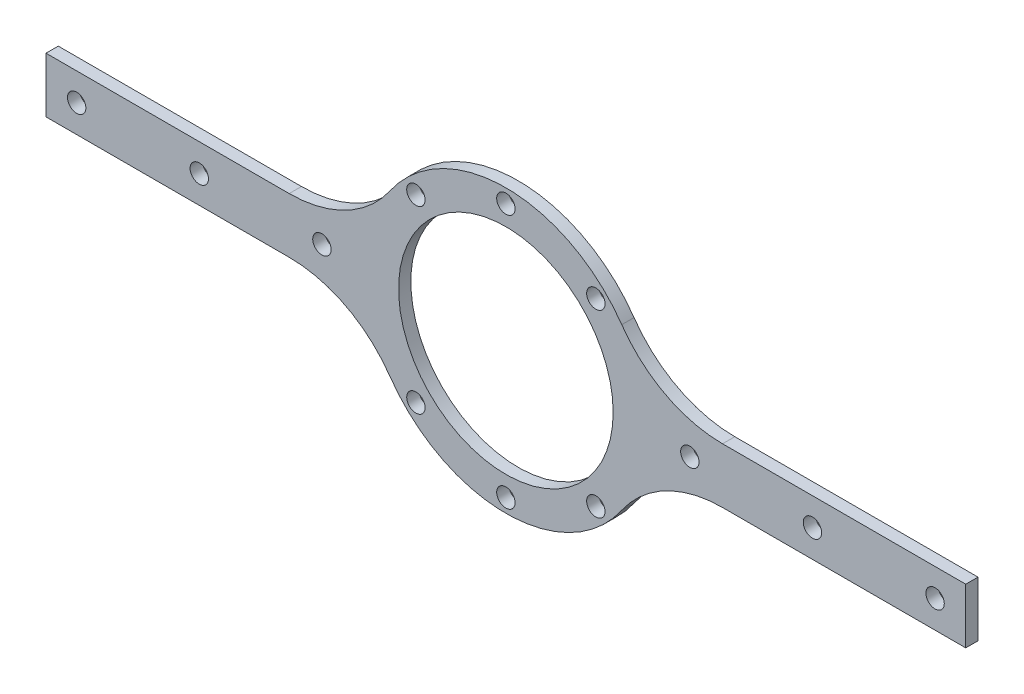
ISO-10303-21;
HEADER;
FILE_DESCRIPTION(('STEP AP214'),'2;1');
FILE_NAME('part.step','',(''),(''),'','','');
FILE_SCHEMA(('AUTOMOTIVE_DESIGN { 1 0 10303 214 1 1 1 1 }'));
ENDSEC;
DATA;
#1=APPLICATION_CONTEXT('core data for automotive mechanical design processes');
#2=APPLICATION_PROTOCOL_DEFINITION('international standard','automotive_design',2000,#1);
#3=PRODUCT_CONTEXT('',#1,'mechanical');
#4=PRODUCT('Part','Part','',(#3));
#5=PRODUCT_RELATED_PRODUCT_CATEGORY('part','',(#4));
#6=PRODUCT_DEFINITION_FORMATION('','',#4);
#7=PRODUCT_DEFINITION_CONTEXT('part definition',#1,'design');
#8=PRODUCT_DEFINITION('design','',#6,#7);
#9=PRODUCT_DEFINITION_SHAPE('','',#8);
#10=(LENGTH_UNIT() NAMED_UNIT(*) SI_UNIT(.MILLI.,.METRE.));
#11=(NAMED_UNIT(*) PLANE_ANGLE_UNIT() SI_UNIT($,.RADIAN.));
#12=(NAMED_UNIT(*) SI_UNIT($,.STERADIAN.) SOLID_ANGLE_UNIT());
#13=UNCERTAINTY_MEASURE_WITH_UNIT(LENGTH_MEASURE(1.E-05),#10,'distance_accuracy_value','');
#14=(GEOMETRIC_REPRESENTATION_CONTEXT(3) GLOBAL_UNCERTAINTY_ASSIGNED_CONTEXT((#13)) GLOBAL_UNIT_ASSIGNED_CONTEXT((#10,
#11,#12)) REPRESENTATION_CONTEXT('',''));
#15=CARTESIAN_POINT('',(0.,0.,0.));
#16=DIRECTION('',(0.,0.,1.));
#17=DIRECTION('',(1.,0.,0.));
#18=AXIS2_PLACEMENT_3D('',#15,#16,#17);
#19=CARTESIAN_POINT('',(75.,-4.5,-2.));
#20=DIRECTION('',(1.,0.,0.));
#21=DIRECTION('',(0.,0.,-1.));
#22=AXIS2_PLACEMENT_3D('',#19,#20,#21);
#23=PLANE('',#22);
#24=DIRECTION('',(0.,1.,0.));
#25=VECTOR('',#24,1.);
#26=CARTESIAN_POINT('',(75.,-4.5,0.));
#27=LINE('',#26,#25);
#28=CARTESIAN_POINT('',(75.,-4.5,0.));
#29=VERTEX_POINT('',#28);
#30=CARTESIAN_POINT('',(75.,4.5,0.));
#31=VERTEX_POINT('',#30);
#32=EDGE_CURVE('E193',#29,#31,#27,.T.);
#33=ORIENTED_EDGE('',*,*,#32,.F.);
#34=DIRECTION('',(0.,0.,1.));
#35=VECTOR('',#34,1.);
#36=CARTESIAN_POINT('',(75.,-4.5,-2.));
#37=LINE('',#36,#35);
#38=CARTESIAN_POINT('',(75.,-4.5,-2.));
#39=VERTEX_POINT('',#38);
#40=EDGE_CURVE('E162',#39,#29,#37,.T.);
#41=ORIENTED_EDGE('',*,*,#40,.F.);
#42=DIRECTION('',(0.,1.,0.));
#43=VECTOR('',#42,1.);
#44=CARTESIAN_POINT('',(75.,-4.5,-2.));
#45=LINE('',#44,#43);
#46=CARTESIAN_POINT('',(75.,4.5,-2.));
#47=VERTEX_POINT('',#46);
#48=EDGE_CURVE('E153',#39,#47,#45,.T.);
#49=ORIENTED_EDGE('',*,*,#48,.T.);
#50=DIRECTION('',(0.,0.,1.));
#51=VECTOR('',#50,1.);
#52=CARTESIAN_POINT('',(75.,4.5,-2.));
#53=LINE('',#52,#51);
#54=EDGE_CURVE('E133',#47,#31,#53,.T.);
#55=ORIENTED_EDGE('',*,*,#54,.T.);
#56=EDGE_LOOP('',(#33,#41,#49,#55));
#57=FACE_BOUND('',#56,.T.);
#58=ADVANCED_FACE('F45',(#57),#23,.T.);
#59=CARTESIAN_POINT('',(22.5554871372799,-4.5,-2.));
#60=DIRECTION('',(0.,-1.,0.));
#61=DIRECTION('',(1.,0.,0.));
#62=AXIS2_PLACEMENT_3D('',#59,#60,#61);
#63=PLANE('',#62);
#64=DIRECTION('',(1.,0.,0.));
#65=VECTOR('',#64,1.);
#66=CARTESIAN_POINT('',(22.5554871372799,-4.5,0.));
#67=LINE('',#66,#65);
#68=CARTESIAN_POINT('',(35.3376569681692,-4.5,0.));
#69=VERTEX_POINT('',#68);
#70=EDGE_CURVE('E164',#69,#29,#67,.T.);
#71=ORIENTED_EDGE('',*,*,#70,.F.);
#72=DIRECTION('',(0.,0.,-1.));
#73=VECTOR('',#72,1.);
#74=CARTESIAN_POINT('',(35.3376569681692,-4.5,-2.));
#75=LINE('',#74,#73);
#76=CARTESIAN_POINT('',(35.3376569681692,-4.5,-2.));
#77=VERTEX_POINT('',#76);
#78=EDGE_CURVE('E231',#69,#77,#75,.T.);
#79=ORIENTED_EDGE('',*,*,#78,.T.);
#80=DIRECTION('',(1.,0.,0.));
#81=VECTOR('',#80,1.);
#82=CARTESIAN_POINT('',(22.5554871372799,-4.5,-2.));
#83=LINE('',#82,#81);
#84=EDGE_CURVE('E147',#77,#39,#83,.T.);
#85=ORIENTED_EDGE('',*,*,#84,.T.);
#86=ORIENTED_EDGE('',*,*,#40,.T.);
#87=EDGE_LOOP('',(#71,#79,#85,#86));
#88=FACE_BOUND('',#87,.T.);
#89=ADVANCED_FACE('F289',(#88),#63,.T.);
#90=CARTESIAN_POINT('',(0.,0.,-2.));
#91=DIRECTION('',(0.,0.,1.));
#92=DIRECTION('',(1.,0.,0.));
#93=AXIS2_PLACEMENT_3D('',#90,#91,#92);
#94=CYLINDRICAL_SURFACE('',#93,23.);
#95=CARTESIAN_POINT('',(0.,0.,-2.));
#96=DIRECTION('',(0.,0.,1.));
#97=DIRECTION('',(-1.,0.,0.));
#98=AXIS2_PLACEMENT_3D('',#95,#96,#97);
#99=CIRCLE('',#98,23.);
#100=CARTESIAN_POINT('',(-18.9015374480905,-13.1046511627907,-2.));
#101=VERTEX_POINT('',#100);
#102=CARTESIAN_POINT('',(18.9015374480905,-13.1046511627907,-2.));
#103=VERTEX_POINT('',#102);
#104=EDGE_CURVE('E187',#101,#103,#99,.T.);
#105=ORIENTED_EDGE('',*,*,#104,.T.);
#106=DIRECTION('',(0.,0.,1.));
#107=VECTOR('',#106,1.);
#108=CARTESIAN_POINT('',(18.9015374480905,-13.1046511627907,-2.));
#109=LINE('',#108,#107);
#110=CARTESIAN_POINT('',(18.9015374480905,-13.1046511627907,0.));
#111=VERTEX_POINT('',#110);
#112=EDGE_CURVE('E227',#103,#111,#109,.T.);
#113=ORIENTED_EDGE('',*,*,#112,.T.);
#114=CARTESIAN_POINT('',(0.,0.,0.));
#115=DIRECTION('',(0.,0.,1.));
#116=DIRECTION('',(-1.,0.,0.));
#117=AXIS2_PLACEMENT_3D('',#114,#115,#116);
#118=CIRCLE('',#117,23.);
#119=CARTESIAN_POINT('',(-18.9015374480905,-13.1046511627907,0.));
#120=VERTEX_POINT('',#119);
#121=EDGE_CURVE('E167',#120,#111,#118,.T.);
#122=ORIENTED_EDGE('',*,*,#121,.F.);
#123=DIRECTION('',(0.,0.,1.));
#124=VECTOR('',#123,1.);
#125=CARTESIAN_POINT('',(-18.9015374480905,-13.1046511627907,-2.));
#126=LINE('',#125,#124);
#127=EDGE_CURVE('E218',#120,#101,#126,.F.);
#128=ORIENTED_EDGE('',*,*,#127,.T.);
#129=EDGE_LOOP('',(#105,#113,#122,#128));
#130=FACE_BOUND('',#129,.T.);
#131=ADVANCED_FACE('F281',(#130),#94,.T.);
#132=CARTESIAN_POINT('',(-75.,-4.5,-2.));
#133=DIRECTION('',(0.,-1.,0.));
#134=DIRECTION('',(1.,0.,0.));
#135=AXIS2_PLACEMENT_3D('',#132,#133,#134);
#136=PLANE('',#135);
#137=DIRECTION('',(1.,0.,0.));
#138=VECTOR('',#137,1.);
#139=CARTESIAN_POINT('',(-75.,-4.5,-2.));
#140=LINE('',#139,#138);
#141=CARTESIAN_POINT('',(-75.,-4.5,-2.));
#142=VERTEX_POINT('',#141);
#143=CARTESIAN_POINT('',(-35.3376569681692,-4.5,-2.));
#144=VERTEX_POINT('',#143);
#145=EDGE_CURVE('E183',#142,#144,#140,.T.);
#146=ORIENTED_EDGE('',*,*,#145,.T.);
#147=DIRECTION('',(0.,0.,-1.));
#148=VECTOR('',#147,1.);
#149=CARTESIAN_POINT('',(-35.3376569681692,-4.5,0.));
#150=LINE('',#149,#148);
#151=CARTESIAN_POINT('',(-35.3376569681692,-4.5,0.));
#152=VERTEX_POINT('',#151);
#153=EDGE_CURVE('E244',#144,#152,#150,.F.);
#154=ORIENTED_EDGE('',*,*,#153,.T.);
#155=DIRECTION('',(1.,0.,0.));
#156=VECTOR('',#155,1.);
#157=CARTESIAN_POINT('',(-75.,-4.5,0.));
#158=LINE('',#157,#156);
#159=CARTESIAN_POINT('',(-75.,-4.5,0.));
#160=VERTEX_POINT('',#159);
#161=EDGE_CURVE('E209',#160,#152,#158,.T.);
#162=ORIENTED_EDGE('',*,*,#161,.F.);
#163=DIRECTION('',(0.,0.,1.));
#164=VECTOR('',#163,1.);
#165=CARTESIAN_POINT('',(-75.,-4.5,-2.));
#166=LINE('',#165,#164);
#167=EDGE_CURVE('E219',#142,#160,#166,.T.);
#168=ORIENTED_EDGE('',*,*,#167,.F.);
#169=EDGE_LOOP('',(#146,#154,#162,#168));
#170=FACE_BOUND('',#169,.T.);
#171=ADVANCED_FACE('F275',(#170),#136,.T.);
#172=CARTESIAN_POINT('',(-75.,-4.5,-2.));
#173=DIRECTION('',(-1.,0.,0.));
#174=DIRECTION('',(0.,0.,1.));
#175=AXIS2_PLACEMENT_3D('',#172,#173,#174);
#176=PLANE('',#175);
#177=DIRECTION('',(0.,-1.,0.));
#178=VECTOR('',#177,1.);
#179=CARTESIAN_POINT('',(-75.,-4.5,0.));
#180=LINE('',#179,#178);
#181=CARTESIAN_POINT('',(-75.,4.5,0.));
#182=VERTEX_POINT('',#181);
#183=EDGE_CURVE('E205',#182,#160,#180,.T.);
#184=ORIENTED_EDGE('',*,*,#183,.F.);
#185=DIRECTION('',(0.,0.,1.));
#186=VECTOR('',#185,1.);
#187=CARTESIAN_POINT('',(-75.,4.5,-2.));
#188=LINE('',#187,#186);
#189=CARTESIAN_POINT('',(-75.,4.5,-2.));
#190=VERTEX_POINT('',#189);
#191=EDGE_CURVE('E146',#190,#182,#188,.T.);
#192=ORIENTED_EDGE('',*,*,#191,.F.);
#193=DIRECTION('',(0.,-1.,0.));
#194=VECTOR('',#193,1.);
#195=CARTESIAN_POINT('',(-75.,-4.5,-2.));
#196=LINE('',#195,#194);
#197=EDGE_CURVE('E179',#190,#142,#196,.T.);
#198=ORIENTED_EDGE('',*,*,#197,.T.);
#199=ORIENTED_EDGE('',*,*,#167,.T.);
#200=EDGE_LOOP('',(#184,#192,#198,#199));
#201=FACE_BOUND('',#200,.T.);
#202=ADVANCED_FACE('F319',(#201),#176,.T.);
#203=CARTESIAN_POINT('',(-75.,4.5,-2.));
#204=DIRECTION('',(0.,1.,0.));
#205=DIRECTION('',(0.,0.,1.));
#206=AXIS2_PLACEMENT_3D('',#203,#204,#205);
#207=PLANE('',#206);
#208=DIRECTION('',(-1.,0.,0.));
#209=VECTOR('',#208,1.);
#210=CARTESIAN_POINT('',(-75.,4.5,0.));
#211=LINE('',#210,#209);
#212=CARTESIAN_POINT('',(-35.3376569681692,4.5,0.));
#213=VERTEX_POINT('',#212);
#214=EDGE_CURVE('E202',#213,#182,#211,.T.);
#215=ORIENTED_EDGE('',*,*,#214,.F.);
#216=DIRECTION('',(0.,0.,-1.));
#217=VECTOR('',#216,1.);
#218=CARTESIAN_POINT('',(-35.3376569681692,4.5,-2.));
#219=LINE('',#218,#217);
#220=CARTESIAN_POINT('',(-35.3376569681692,4.5,-2.));
#221=VERTEX_POINT('',#220);
#222=EDGE_CURVE('E61',#213,#221,#219,.T.);
#223=ORIENTED_EDGE('',*,*,#222,.T.);
#224=DIRECTION('',(-1.,0.,0.));
#225=VECTOR('',#224,1.);
#226=CARTESIAN_POINT('',(-75.,4.5,-2.));
#227=LINE('',#226,#225);
#228=EDGE_CURVE('E176',#221,#190,#227,.T.);
#229=ORIENTED_EDGE('',*,*,#228,.T.);
#230=ORIENTED_EDGE('',*,*,#191,.T.);
#231=EDGE_LOOP('',(#215,#223,#229,#230));
#232=FACE_BOUND('',#231,.T.);
#233=ADVANCED_FACE('F316',(#232),#207,.T.);
#234=CARTESIAN_POINT('',(0.,0.,-2.));
#235=DIRECTION('',(0.,0.,1.));
#236=DIRECTION('',(1.,0.,0.));
#237=AXIS2_PLACEMENT_3D('',#234,#235,#236);
#238=CYLINDRICAL_SURFACE('',#237,23.);
#239=CARTESIAN_POINT('',(0.,0.,0.));
#240=DIRECTION('',(0.,0.,1.));
#241=DIRECTION('',(-1.,0.,0.));
#242=AXIS2_PLACEMENT_3D('',#239,#240,#241);
#243=CIRCLE('',#242,23.);
#244=CARTESIAN_POINT('',(18.9015374480905,13.1046511627907,0.));
#245=VERTEX_POINT('',#244);
#246=CARTESIAN_POINT('',(-18.9015374480905,13.1046511627907,0.));
#247=VERTEX_POINT('',#246);
#248=EDGE_CURVE('E199',#245,#247,#243,.T.);
#249=ORIENTED_EDGE('',*,*,#248,.F.);
#250=DIRECTION('',(0.,0.,1.));
#251=VECTOR('',#250,1.);
#252=CARTESIAN_POINT('',(18.9015374480905,13.1046511627907,-2.));
#253=LINE('',#252,#251);
#254=CARTESIAN_POINT('',(18.9015374480905,13.1046511627907,-2.));
#255=VERTEX_POINT('',#254);
#256=EDGE_CURVE('E241',#245,#255,#253,.F.);
#257=ORIENTED_EDGE('',*,*,#256,.T.);
#258=CARTESIAN_POINT('',(0.,0.,-2.));
#259=DIRECTION('',(0.,0.,1.));
#260=DIRECTION('',(-1.,0.,0.));
#261=AXIS2_PLACEMENT_3D('',#258,#259,#260);
#262=CIRCLE('',#261,23.);
#263=CARTESIAN_POINT('',(-18.9015374480905,13.1046511627907,-2.));
#264=VERTEX_POINT('',#263);
#265=EDGE_CURVE('E158',#255,#264,#262,.T.);
#266=ORIENTED_EDGE('',*,*,#265,.T.);
#267=DIRECTION('',(0.,0.,1.));
#268=VECTOR('',#267,1.);
#269=CARTESIAN_POINT('',(-18.9015374480905,13.1046511627907,-2.));
#270=LINE('',#269,#268);
#271=EDGE_CURVE('E237',#264,#247,#270,.T.);
#272=ORIENTED_EDGE('',*,*,#271,.T.);
#273=EDGE_LOOP('',(#249,#257,#266,#272));
#274=FACE_BOUND('',#273,.T.);
#275=ADVANCED_FACE('F294',(#274),#238,.T.);
#276=CARTESIAN_POINT('',(22.5554871372799,4.5,-2.));
#277=DIRECTION('',(0.,1.,0.));
#278=DIRECTION('',(0.,0.,1.));
#279=AXIS2_PLACEMENT_3D('',#276,#277,#278);
#280=PLANE('',#279);
#281=DIRECTION('',(-1.,0.,0.));
#282=VECTOR('',#281,1.);
#283=CARTESIAN_POINT('',(22.5554871372799,4.5,-2.));
#284=LINE('',#283,#282);
#285=CARTESIAN_POINT('',(35.3376569681692,4.5,-2.));
#286=VERTEX_POINT('',#285);
#287=EDGE_CURVE('E137',#47,#286,#284,.T.);
#288=ORIENTED_EDGE('',*,*,#287,.T.);
#289=DIRECTION('',(0.,0.,-1.));
#290=VECTOR('',#289,1.);
#291=CARTESIAN_POINT('',(35.3376569681692,4.5,0.));
#292=LINE('',#291,#290);
#293=CARTESIAN_POINT('',(35.3376569681692,4.5,0.));
#294=VERTEX_POINT('',#293);
#295=EDGE_CURVE('E234',#286,#294,#292,.F.);
#296=ORIENTED_EDGE('',*,*,#295,.T.);
#297=DIRECTION('',(-1.,0.,0.));
#298=VECTOR('',#297,1.);
#299=CARTESIAN_POINT('',(22.5554871372799,4.5,0.));
#300=LINE('',#299,#298);
#301=EDGE_CURVE('E140',#31,#294,#300,.T.);
#302=ORIENTED_EDGE('',*,*,#301,.F.);
#303=ORIENTED_EDGE('',*,*,#54,.F.);
#304=EDGE_LOOP('',(#288,#296,#302,#303));
#305=FACE_BOUND('',#304,.T.);
#306=ADVANCED_FACE('F135',(#305),#280,.T.);
#307=CARTESIAN_POINT('',(0.,0.,-2.));
#308=DIRECTION('',(0.,0.,-1.));
#309=DIRECTION('',(-1.,0.,0.));
#310=AXIS2_PLACEMENT_3D('',#307,#308,#309);
#311=PLANE('',#310);
#312=CARTESIAN_POINT('',(70.,0.,-2.));
#313=DIRECTION('',(0.,0.,1.));
#314=DIRECTION('',(1.,0.,0.));
#315=AXIS2_PLACEMENT_3D('',#312,#313,#314);
#316=CIRCLE('',#315,1.5);
#317=CARTESIAN_POINT('',(71.5,0.,-2.));
#318=VERTEX_POINT('',#317);
#319=EDGE_CURVE('E388',#318,#318,#316,.T.);
#320=ORIENTED_EDGE('',*,*,#319,.T.);
#321=EDGE_LOOP('',(#320));
#322=FACE_BOUND('',#321,.T.);
#323=CARTESIAN_POINT('',(50.,0.,-2.));
#324=DIRECTION('',(0.,0.,1.));
#325=DIRECTION('',(1.,0.,0.));
#326=AXIS2_PLACEMENT_3D('',#323,#324,#325);
#327=CIRCLE('',#326,1.5);
#328=CARTESIAN_POINT('',(51.5,0.,-2.));
#329=VERTEX_POINT('',#328);
#330=EDGE_CURVE('E398',#329,#329,#327,.T.);
#331=ORIENTED_EDGE('',*,*,#330,.T.);
#332=EDGE_LOOP('',(#331));
#333=FACE_BOUND('',#332,.T.);
#334=CARTESIAN_POINT('',(30.,0.,-2.));
#335=DIRECTION('',(0.,0.,1.));
#336=DIRECTION('',(1.,0.,0.));
#337=AXIS2_PLACEMENT_3D('',#334,#335,#336);
#338=CIRCLE('',#337,1.5);
#339=CARTESIAN_POINT('',(31.5,0.,-2.));
#340=VERTEX_POINT('',#339);
#341=EDGE_CURVE('E406',#340,#340,#338,.T.);
#342=ORIENTED_EDGE('',*,*,#341,.T.);
#343=EDGE_LOOP('',(#342));
#344=FACE_BOUND('',#343,.T.);
#345=CARTESIAN_POINT('',(-30.,0.,-2.));
#346=DIRECTION('',(0.,0.,1.));
#347=DIRECTION('',(1.,0.,0.));
#348=AXIS2_PLACEMENT_3D('',#345,#346,#347);
#349=CIRCLE('',#348,1.5);
#350=CARTESIAN_POINT('',(-28.5,0.,-2.));
#351=VERTEX_POINT('',#350);
#352=EDGE_CURVE('E414',#351,#351,#349,.T.);
#353=ORIENTED_EDGE('',*,*,#352,.T.);
#354=EDGE_LOOP('',(#353));
#355=FACE_BOUND('',#354,.T.);
#356=CARTESIAN_POINT('',(-50.,0.,-2.));
#357=DIRECTION('',(0.,0.,1.));
#358=DIRECTION('',(1.,0.,0.));
#359=AXIS2_PLACEMENT_3D('',#356,#357,#358);
#360=CIRCLE('',#359,1.5);
#361=CARTESIAN_POINT('',(-48.5,0.,-2.));
#362=VERTEX_POINT('',#361);
#363=EDGE_CURVE('E422',#362,#362,#360,.T.);
#364=ORIENTED_EDGE('',*,*,#363,.T.);
#365=EDGE_LOOP('',(#364));
#366=FACE_BOUND('',#365,.T.);
#367=CARTESIAN_POINT('',(-70.,0.,-2.));
#368=DIRECTION('',(0.,0.,1.));
#369=DIRECTION('',(1.,0.,0.));
#370=AXIS2_PLACEMENT_3D('',#367,#368,#369);
#371=CIRCLE('',#370,1.5);
#372=CARTESIAN_POINT('',(-68.5,0.,-2.));
#373=VERTEX_POINT('',#372);
#374=EDGE_CURVE('E430',#373,#373,#371,.T.);
#375=ORIENTED_EDGE('',*,*,#374,.T.);
#376=EDGE_LOOP('',(#375));
#377=FACE_BOUND('',#376,.T.);
#378=CARTESIAN_POINT('',(0.,0.,-2.));
#379=DIRECTION('',(0.,0.,1.));
#380=DIRECTION('',(1.,0.,0.));
#381=AXIS2_PLACEMENT_3D('',#378,#379,#380);
#382=CIRCLE('',#381,17.5);
#383=CARTESIAN_POINT('',(17.5,0.,-2.));
#384=VERTEX_POINT('',#383);
#385=EDGE_CURVE('E438',#384,#384,#382,.T.);
#386=ORIENTED_EDGE('',*,*,#385,.T.);
#387=EDGE_LOOP('',(#386));
#388=FACE_BOUND('',#387,.T.);
#389=CARTESIAN_POINT('',(-14.6724657096209,14.6724657096209,-2.));
#390=DIRECTION('',(0.,0.,1.));
#391=DIRECTION('',(1.,0.,0.));
#392=AXIS2_PLACEMENT_3D('',#389,#390,#391);
#393=CIRCLE('',#392,1.5);
#394=CARTESIAN_POINT('',(-13.1724657096209,14.6724657096209,-2.));
#395=VERTEX_POINT('',#394);
#396=EDGE_CURVE('E446',#395,#395,#393,.T.);
#397=ORIENTED_EDGE('',*,*,#396,.T.);
#398=EDGE_LOOP('',(#397));
#399=FACE_BOUND('',#398,.T.);
#400=CARTESIAN_POINT('',(-14.6724657096209,-14.6724657096209,-2.));
#401=DIRECTION('',(0.,0.,1.));
#402=DIRECTION('',(1.,0.,0.));
#403=AXIS2_PLACEMENT_3D('',#400,#401,#402);
#404=CIRCLE('',#403,1.5);
#405=CARTESIAN_POINT('',(-13.1724657096209,-14.6724657096209,-2.));
#406=VERTEX_POINT('',#405);
#407=EDGE_CURVE('E454',#406,#406,#404,.T.);
#408=ORIENTED_EDGE('',*,*,#407,.T.);
#409=EDGE_LOOP('',(#408));
#410=FACE_BOUND('',#409,.T.);
#411=CARTESIAN_POINT('',(0.,-20.75,-2.));
#412=DIRECTION('',(0.,0.,1.));
#413=DIRECTION('',(1.,0.,0.));
#414=AXIS2_PLACEMENT_3D('',#411,#412,#413);
#415=CIRCLE('',#414,1.5);
#416=CARTESIAN_POINT('',(1.5,-20.75,-2.));
#417=VERTEX_POINT('',#416);
#418=EDGE_CURVE('E462',#417,#417,#415,.T.);
#419=ORIENTED_EDGE('',*,*,#418,.T.);
#420=EDGE_LOOP('',(#419));
#421=FACE_BOUND('',#420,.T.);
#422=CARTESIAN_POINT('',(14.6724657096209,-14.6724657096209,-2.));
#423=DIRECTION('',(0.,0.,1.));
#424=DIRECTION('',(1.,0.,0.));
#425=AXIS2_PLACEMENT_3D('',#422,#423,#424);
#426=CIRCLE('',#425,1.5);
#427=CARTESIAN_POINT('',(16.1724657096209,-14.6724657096209,-2.));
#428=VERTEX_POINT('',#427);
#429=EDGE_CURVE('E470',#428,#428,#426,.T.);
#430=ORIENTED_EDGE('',*,*,#429,.T.);
#431=EDGE_LOOP('',(#430));
#432=FACE_BOUND('',#431,.T.);
#433=CARTESIAN_POINT('',(14.6724657096209,14.6724657096209,-2.));
#434=DIRECTION('',(0.,0.,1.));
#435=DIRECTION('',(1.,0.,0.));
#436=AXIS2_PLACEMENT_3D('',#433,#434,#435);
#437=CIRCLE('',#436,1.5);
#438=CARTESIAN_POINT('',(16.1724657096209,14.6724657096209,-2.));
#439=VERTEX_POINT('',#438);
#440=EDGE_CURVE('E478',#439,#439,#437,.T.);
#441=ORIENTED_EDGE('',*,*,#440,.T.);
#442=EDGE_LOOP('',(#441));
#443=FACE_BOUND('',#442,.T.);
#444=CARTESIAN_POINT('',(0.,20.75,-2.));
#445=DIRECTION('',(0.,0.,1.));
#446=DIRECTION('',(1.,0.,0.));
#447=AXIS2_PLACEMENT_3D('',#444,#445,#446);
#448=CIRCLE('',#447,1.5);
#449=CARTESIAN_POINT('',(1.5,20.75,-2.));
#450=VERTEX_POINT('',#449);
#451=EDGE_CURVE('E196',#450,#450,#448,.T.);
#452=ORIENTED_EDGE('',*,*,#451,.T.);
#453=EDGE_LOOP('',(#452));
#454=FACE_BOUND('',#453,.T.);
#455=ORIENTED_EDGE('',*,*,#48,.F.);
#456=ORIENTED_EDGE('',*,*,#84,.F.);
#457=CARTESIAN_POINT('',(35.3376569681692,-24.5,-2.));
#458=DIRECTION('',(0.,0.,-1.));
#459=DIRECTION('',(-1.,0.,0.));
#460=AXIS2_PLACEMENT_3D('',#457,#458,#459);
#461=CIRCLE('',#460,20.);
#462=EDGE_CURVE('E253',#77,#103,#461,.F.);
#463=ORIENTED_EDGE('',*,*,#462,.T.);
#464=ORIENTED_EDGE('',*,*,#104,.F.);
#465=CARTESIAN_POINT('',(-35.3376569681692,-24.5,-2.));
#466=DIRECTION('',(0.,0.,-1.));
#467=DIRECTION('',(-1.,0.,0.));
#468=AXIS2_PLACEMENT_3D('',#465,#466,#467);
#469=CIRCLE('',#468,20.);
#470=EDGE_CURVE('E264',#101,#144,#469,.F.);
#471=ORIENTED_EDGE('',*,*,#470,.T.);
#472=ORIENTED_EDGE('',*,*,#145,.F.);
#473=ORIENTED_EDGE('',*,*,#197,.F.);
#474=ORIENTED_EDGE('',*,*,#228,.F.);
#475=CARTESIAN_POINT('',(-35.3376569681692,24.5,-2.));
#476=DIRECTION('',(0.,0.,-1.));
#477=DIRECTION('',(-1.,0.,0.));
#478=AXIS2_PLACEMENT_3D('',#475,#476,#477);
#479=CIRCLE('',#478,20.);
#480=EDGE_CURVE('E11',#221,#264,#479,.F.);
#481=ORIENTED_EDGE('',*,*,#480,.T.);
#482=ORIENTED_EDGE('',*,*,#265,.F.);
#483=CARTESIAN_POINT('',(35.3376569681692,24.5,-2.));
#484=DIRECTION('',(0.,0.,-1.));
#485=DIRECTION('',(-1.,0.,0.));
#486=AXIS2_PLACEMENT_3D('',#483,#484,#485);
#487=CIRCLE('',#486,20.);
#488=EDGE_CURVE('E156',#255,#286,#487,.F.);
#489=ORIENTED_EDGE('',*,*,#488,.T.);
#490=ORIENTED_EDGE('',*,*,#287,.F.);
#491=EDGE_LOOP('',(#455,#456,#463,#464,#471,#472,#473,#474,#481,#482,#489,#490));
#492=FACE_BOUND('',#491,.T.);
#493=ADVANCED_FACE('F151',(#322,#333,#344,#355,#366,#377,#388,#399,#410,#421,#432,#443,#454,
#492),#311,.T.);
#494=CARTESIAN_POINT('',(0.,0.,0.));
#495=DIRECTION('',(0.,0.,-1.));
#496=DIRECTION('',(-1.,0.,0.));
#497=AXIS2_PLACEMENT_3D('',#494,#495,#496);
#498=PLANE('',#497);
#499=CARTESIAN_POINT('',(70.,0.,0.));
#500=DIRECTION('',(0.,0.,1.));
#501=DIRECTION('',(1.,0.,0.));
#502=AXIS2_PLACEMENT_3D('',#499,#500,#501);
#503=CIRCLE('',#502,1.5);
#504=CARTESIAN_POINT('',(71.5,0.,0.));
#505=VERTEX_POINT('',#504);
#506=EDGE_CURVE('E391',#505,#505,#503,.T.);
#507=ORIENTED_EDGE('',*,*,#506,.F.);
#508=EDGE_LOOP('',(#507));
#509=FACE_BOUND('',#508,.T.);
#510=CARTESIAN_POINT('',(50.,0.,0.));
#511=DIRECTION('',(0.,0.,1.));
#512=DIRECTION('',(1.,0.,0.));
#513=AXIS2_PLACEMENT_3D('',#510,#511,#512);
#514=CIRCLE('',#513,1.5);
#515=CARTESIAN_POINT('',(51.5,0.,0.));
#516=VERTEX_POINT('',#515);
#517=EDGE_CURVE('E395',#516,#516,#514,.T.);
#518=ORIENTED_EDGE('',*,*,#517,.F.);
#519=EDGE_LOOP('',(#518));
#520=FACE_BOUND('',#519,.T.);
#521=CARTESIAN_POINT('',(30.,0.,0.));
#522=DIRECTION('',(0.,0.,1.));
#523=DIRECTION('',(1.,0.,0.));
#524=AXIS2_PLACEMENT_3D('',#521,#522,#523);
#525=CIRCLE('',#524,1.5);
#526=CARTESIAN_POINT('',(31.5,0.,0.));
#527=VERTEX_POINT('',#526);
#528=EDGE_CURVE('E402',#527,#527,#525,.T.);
#529=ORIENTED_EDGE('',*,*,#528,.F.);
#530=EDGE_LOOP('',(#529));
#531=FACE_BOUND('',#530,.T.);
#532=CARTESIAN_POINT('',(-30.,0.,0.));
#533=DIRECTION('',(0.,0.,1.));
#534=DIRECTION('',(1.,0.,0.));
#535=AXIS2_PLACEMENT_3D('',#532,#533,#534);
#536=CIRCLE('',#535,1.5);
#537=CARTESIAN_POINT('',(-28.5,0.,0.));
#538=VERTEX_POINT('',#537);
#539=EDGE_CURVE('E410',#538,#538,#536,.T.);
#540=ORIENTED_EDGE('',*,*,#539,.F.);
#541=EDGE_LOOP('',(#540));
#542=FACE_BOUND('',#541,.T.);
#543=CARTESIAN_POINT('',(-50.,0.,0.));
#544=DIRECTION('',(0.,0.,1.));
#545=DIRECTION('',(1.,0.,0.));
#546=AXIS2_PLACEMENT_3D('',#543,#544,#545);
#547=CIRCLE('',#546,1.5);
#548=CARTESIAN_POINT('',(-48.5,0.,0.));
#549=VERTEX_POINT('',#548);
#550=EDGE_CURVE('E418',#549,#549,#547,.T.);
#551=ORIENTED_EDGE('',*,*,#550,.F.);
#552=EDGE_LOOP('',(#551));
#553=FACE_BOUND('',#552,.T.);
#554=CARTESIAN_POINT('',(-70.,0.,0.));
#555=DIRECTION('',(0.,0.,1.));
#556=DIRECTION('',(1.,0.,0.));
#557=AXIS2_PLACEMENT_3D('',#554,#555,#556);
#558=CIRCLE('',#557,1.5);
#559=CARTESIAN_POINT('',(-68.5,0.,0.));
#560=VERTEX_POINT('',#559);
#561=EDGE_CURVE('E426',#560,#560,#558,.T.);
#562=ORIENTED_EDGE('',*,*,#561,.F.);
#563=EDGE_LOOP('',(#562));
#564=FACE_BOUND('',#563,.T.);
#565=CARTESIAN_POINT('',(0.,0.,0.));
#566=DIRECTION('',(0.,0.,1.));
#567=DIRECTION('',(1.,0.,0.));
#568=AXIS2_PLACEMENT_3D('',#565,#566,#567);
#569=CIRCLE('',#568,17.5);
#570=CARTESIAN_POINT('',(17.5,0.,0.));
#571=VERTEX_POINT('',#570);
#572=EDGE_CURVE('E434',#571,#571,#569,.T.);
#573=ORIENTED_EDGE('',*,*,#572,.F.);
#574=EDGE_LOOP('',(#573));
#575=FACE_BOUND('',#574,.T.);
#576=CARTESIAN_POINT('',(-14.6724657096209,14.6724657096209,0.));
#577=DIRECTION('',(0.,0.,1.));
#578=DIRECTION('',(1.,0.,0.));
#579=AXIS2_PLACEMENT_3D('',#576,#577,#578);
#580=CIRCLE('',#579,1.5);
#581=CARTESIAN_POINT('',(-13.1724657096209,14.6724657096209,0.));
#582=VERTEX_POINT('',#581);
#583=EDGE_CURVE('E442',#582,#582,#580,.T.);
#584=ORIENTED_EDGE('',*,*,#583,.F.);
#585=EDGE_LOOP('',(#584));
#586=FACE_BOUND('',#585,.T.);
#587=CARTESIAN_POINT('',(-14.6724657096209,-14.6724657096209,0.));
#588=DIRECTION('',(0.,0.,1.));
#589=DIRECTION('',(1.,0.,0.));
#590=AXIS2_PLACEMENT_3D('',#587,#588,#589);
#591=CIRCLE('',#590,1.5);
#592=CARTESIAN_POINT('',(-13.1724657096209,-14.6724657096209,0.));
#593=VERTEX_POINT('',#592);
#594=EDGE_CURVE('E450',#593,#593,#591,.T.);
#595=ORIENTED_EDGE('',*,*,#594,.F.);
#596=EDGE_LOOP('',(#595));
#597=FACE_BOUND('',#596,.T.);
#598=CARTESIAN_POINT('',(0.,-20.75,0.));
#599=DIRECTION('',(0.,0.,1.));
#600=DIRECTION('',(1.,0.,0.));
#601=AXIS2_PLACEMENT_3D('',#598,#599,#600);
#602=CIRCLE('',#601,1.5);
#603=CARTESIAN_POINT('',(1.5,-20.75,0.));
#604=VERTEX_POINT('',#603);
#605=EDGE_CURVE('E458',#604,#604,#602,.T.);
#606=ORIENTED_EDGE('',*,*,#605,.F.);
#607=EDGE_LOOP('',(#606));
#608=FACE_BOUND('',#607,.T.);
#609=CARTESIAN_POINT('',(14.6724657096209,-14.6724657096209,0.));
#610=DIRECTION('',(0.,0.,1.));
#611=DIRECTION('',(1.,0.,0.));
#612=AXIS2_PLACEMENT_3D('',#609,#610,#611);
#613=CIRCLE('',#612,1.5);
#614=CARTESIAN_POINT('',(16.1724657096209,-14.6724657096209,0.));
#615=VERTEX_POINT('',#614);
#616=EDGE_CURVE('E466',#615,#615,#613,.T.);
#617=ORIENTED_EDGE('',*,*,#616,.F.);
#618=EDGE_LOOP('',(#617));
#619=FACE_BOUND('',#618,.T.);
#620=CARTESIAN_POINT('',(14.6724657096209,14.6724657096209,0.));
#621=DIRECTION('',(0.,0.,1.));
#622=DIRECTION('',(1.,0.,0.));
#623=AXIS2_PLACEMENT_3D('',#620,#621,#622);
#624=CIRCLE('',#623,1.5);
#625=CARTESIAN_POINT('',(16.1724657096209,14.6724657096209,0.));
#626=VERTEX_POINT('',#625);
#627=EDGE_CURVE('E474',#626,#626,#624,.T.);
#628=ORIENTED_EDGE('',*,*,#627,.F.);
#629=EDGE_LOOP('',(#628));
#630=FACE_BOUND('',#629,.T.);
#631=CARTESIAN_POINT('',(0.,20.75,0.));
#632=DIRECTION('',(0.,0.,1.));
#633=DIRECTION('',(1.,0.,0.));
#634=AXIS2_PLACEMENT_3D('',#631,#632,#633);
#635=CIRCLE('',#634,1.5);
#636=CARTESIAN_POINT('',(1.5,20.75,0.));
#637=VERTEX_POINT('',#636);
#638=EDGE_CURVE('E170',#637,#637,#635,.T.);
#639=ORIENTED_EDGE('',*,*,#638,.F.);
#640=EDGE_LOOP('',(#639));
#641=FACE_BOUND('',#640,.T.);
#642=ORIENTED_EDGE('',*,*,#32,.T.);
#643=ORIENTED_EDGE('',*,*,#301,.T.);
#644=CARTESIAN_POINT('',(35.3376569681692,24.5,0.));
#645=DIRECTION('',(0.,0.,-1.));
#646=DIRECTION('',(-1.,0.,0.));
#647=AXIS2_PLACEMENT_3D('',#644,#645,#646);
#648=CIRCLE('',#647,20.);
#649=EDGE_CURVE('E256',#294,#245,#648,.T.);
#650=ORIENTED_EDGE('',*,*,#649,.T.);
#651=ORIENTED_EDGE('',*,*,#248,.T.);
#652=CARTESIAN_POINT('',(-35.3376569681692,24.5,0.));
#653=DIRECTION('',(0.,0.,-1.));
#654=DIRECTION('',(-1.,0.,0.));
#655=AXIS2_PLACEMENT_3D('',#652,#653,#654);
#656=CIRCLE('',#655,20.);
#657=EDGE_CURVE('E54',#247,#213,#656,.T.);
#658=ORIENTED_EDGE('',*,*,#657,.T.);
#659=ORIENTED_EDGE('',*,*,#214,.T.);
#660=ORIENTED_EDGE('',*,*,#183,.T.);
#661=ORIENTED_EDGE('',*,*,#161,.T.);
#662=CARTESIAN_POINT('',(-35.3376569681692,-24.5,0.));
#663=DIRECTION('',(0.,0.,-1.));
#664=DIRECTION('',(-1.,0.,0.));
#665=AXIS2_PLACEMENT_3D('',#662,#663,#664);
#666=CIRCLE('',#665,20.);
#667=EDGE_CURVE('E261',#152,#120,#666,.T.);
#668=ORIENTED_EDGE('',*,*,#667,.T.);
#669=ORIENTED_EDGE('',*,*,#121,.T.);
#670=CARTESIAN_POINT('',(35.3376569681692,-24.5,0.));
#671=DIRECTION('',(0.,0.,-1.));
#672=DIRECTION('',(-1.,0.,0.));
#673=AXIS2_PLACEMENT_3D('',#670,#671,#672);
#674=CIRCLE('',#673,20.);
#675=EDGE_CURVE('E250',#111,#69,#674,.T.);
#676=ORIENTED_EDGE('',*,*,#675,.T.);
#677=ORIENTED_EDGE('',*,*,#70,.T.);
#678=EDGE_LOOP('',(#642,#643,#650,#651,#658,#659,#660,#661,#668,#669,#676,#677));
#679=FACE_BOUND('',#678,.T.);
#680=ADVANCED_FACE('F279',(#509,#520,#531,#542,#553,#564,#575,#586,#597,#608,#619,#630,#641,
#679),#498,.F.);
#681=CARTESIAN_POINT('',(0.,20.75,-2.));
#682=DIRECTION('',(0.,0.,1.));
#683=DIRECTION('',(1.,0.,0.));
#684=AXIS2_PLACEMENT_3D('',#681,#682,#683);
#685=CYLINDRICAL_SURFACE('',#684,1.5);
#686=ORIENTED_EDGE('',*,*,#451,.F.);
#687=EDGE_LOOP('',(#686));
#688=FACE_BOUND('',#687,.T.);
#689=ORIENTED_EDGE('',*,*,#638,.T.);
#690=EDGE_LOOP('',(#689));
#691=FACE_BOUND('',#690,.T.);
#692=ADVANCED_FACE('F329',(#688,#691),#685,.F.);
#693=CARTESIAN_POINT('',(14.6724657096209,14.6724657096209,-2.));
#694=DIRECTION('',(0.,0.,1.));
#695=DIRECTION('',(1.,0.,0.));
#696=AXIS2_PLACEMENT_3D('',#693,#694,#695);
#697=CYLINDRICAL_SURFACE('',#696,1.5);
#698=ORIENTED_EDGE('',*,*,#440,.F.);
#699=EDGE_LOOP('',(#698));
#700=FACE_BOUND('',#699,.T.);
#701=ORIENTED_EDGE('',*,*,#627,.T.);
#702=EDGE_LOOP('',(#701));
#703=FACE_BOUND('',#702,.T.);
#704=ADVANCED_FACE('F336',(#700,#703),#697,.F.);
#705=CARTESIAN_POINT('',(14.6724657096209,-14.6724657096209,-2.));
#706=DIRECTION('',(0.,0.,1.));
#707=DIRECTION('',(1.,0.,0.));
#708=AXIS2_PLACEMENT_3D('',#705,#706,#707);
#709=CYLINDRICAL_SURFACE('',#708,1.5);
#710=ORIENTED_EDGE('',*,*,#429,.F.);
#711=EDGE_LOOP('',(#710));
#712=FACE_BOUND('',#711,.T.);
#713=ORIENTED_EDGE('',*,*,#616,.T.);
#714=EDGE_LOOP('',(#713));
#715=FACE_BOUND('',#714,.T.);
#716=ADVANCED_FACE('F340',(#712,#715),#709,.F.);
#717=CARTESIAN_POINT('',(0.,-20.75,-2.));
#718=DIRECTION('',(0.,0.,1.));
#719=DIRECTION('',(1.,0.,0.));
#720=AXIS2_PLACEMENT_3D('',#717,#718,#719);
#721=CYLINDRICAL_SURFACE('',#720,1.5);
#722=ORIENTED_EDGE('',*,*,#418,.F.);
#723=EDGE_LOOP('',(#722));
#724=FACE_BOUND('',#723,.T.);
#725=ORIENTED_EDGE('',*,*,#605,.T.);
#726=EDGE_LOOP('',(#725));
#727=FACE_BOUND('',#726,.T.);
#728=ADVANCED_FACE('F344',(#724,#727),#721,.F.);
#729=CARTESIAN_POINT('',(-14.6724657096209,-14.6724657096209,-2.));
#730=DIRECTION('',(0.,0.,1.));
#731=DIRECTION('',(1.,0.,0.));
#732=AXIS2_PLACEMENT_3D('',#729,#730,#731);
#733=CYLINDRICAL_SURFACE('',#732,1.5);
#734=ORIENTED_EDGE('',*,*,#407,.F.);
#735=EDGE_LOOP('',(#734));
#736=FACE_BOUND('',#735,.T.);
#737=ORIENTED_EDGE('',*,*,#594,.T.);
#738=EDGE_LOOP('',(#737));
#739=FACE_BOUND('',#738,.T.);
#740=ADVANCED_FACE('F348',(#736,#739),#733,.F.);
#741=CARTESIAN_POINT('',(-14.6724657096209,14.6724657096209,-2.));
#742=DIRECTION('',(0.,0.,1.));
#743=DIRECTION('',(1.,0.,0.));
#744=AXIS2_PLACEMENT_3D('',#741,#742,#743);
#745=CYLINDRICAL_SURFACE('',#744,1.5);
#746=ORIENTED_EDGE('',*,*,#396,.F.);
#747=EDGE_LOOP('',(#746));
#748=FACE_BOUND('',#747,.T.);
#749=ORIENTED_EDGE('',*,*,#583,.T.);
#750=EDGE_LOOP('',(#749));
#751=FACE_BOUND('',#750,.T.);
#752=ADVANCED_FACE('F352',(#748,#751),#745,.F.);
#753=CARTESIAN_POINT('',(0.,0.,-2.));
#754=DIRECTION('',(0.,0.,1.));
#755=DIRECTION('',(1.,0.,0.));
#756=AXIS2_PLACEMENT_3D('',#753,#754,#755);
#757=CYLINDRICAL_SURFACE('',#756,17.5);
#758=ORIENTED_EDGE('',*,*,#385,.F.);
#759=EDGE_LOOP('',(#758));
#760=FACE_BOUND('',#759,.T.);
#761=ORIENTED_EDGE('',*,*,#572,.T.);
#762=EDGE_LOOP('',(#761));
#763=FACE_BOUND('',#762,.T.);
#764=ADVANCED_FACE('F356',(#760,#763),#757,.F.);
#765=CARTESIAN_POINT('',(-70.,0.,-2.));
#766=DIRECTION('',(0.,0.,1.));
#767=DIRECTION('',(1.,0.,0.));
#768=AXIS2_PLACEMENT_3D('',#765,#766,#767);
#769=CYLINDRICAL_SURFACE('',#768,1.5);
#770=ORIENTED_EDGE('',*,*,#374,.F.);
#771=EDGE_LOOP('',(#770));
#772=FACE_BOUND('',#771,.T.);
#773=ORIENTED_EDGE('',*,*,#561,.T.);
#774=EDGE_LOOP('',(#773));
#775=FACE_BOUND('',#774,.T.);
#776=ADVANCED_FACE('F360',(#772,#775),#769,.F.);
#777=CARTESIAN_POINT('',(-50.,0.,-2.));
#778=DIRECTION('',(0.,0.,1.));
#779=DIRECTION('',(1.,0.,0.));
#780=AXIS2_PLACEMENT_3D('',#777,#778,#779);
#781=CYLINDRICAL_SURFACE('',#780,1.5);
#782=ORIENTED_EDGE('',*,*,#363,.F.);
#783=EDGE_LOOP('',(#782));
#784=FACE_BOUND('',#783,.T.);
#785=ORIENTED_EDGE('',*,*,#550,.T.);
#786=EDGE_LOOP('',(#785));
#787=FACE_BOUND('',#786,.T.);
#788=ADVANCED_FACE('F364',(#784,#787),#781,.F.);
#789=CARTESIAN_POINT('',(-30.,0.,-2.));
#790=DIRECTION('',(0.,0.,1.));
#791=DIRECTION('',(1.,0.,0.));
#792=AXIS2_PLACEMENT_3D('',#789,#790,#791);
#793=CYLINDRICAL_SURFACE('',#792,1.5);
#794=ORIENTED_EDGE('',*,*,#352,.F.);
#795=EDGE_LOOP('',(#794));
#796=FACE_BOUND('',#795,.T.);
#797=ORIENTED_EDGE('',*,*,#539,.T.);
#798=EDGE_LOOP('',(#797));
#799=FACE_BOUND('',#798,.T.);
#800=ADVANCED_FACE('F368',(#796,#799),#793,.F.);
#801=CARTESIAN_POINT('',(30.,0.,-2.));
#802=DIRECTION('',(0.,0.,1.));
#803=DIRECTION('',(1.,0.,0.));
#804=AXIS2_PLACEMENT_3D('',#801,#802,#803);
#805=CYLINDRICAL_SURFACE('',#804,1.5);
#806=ORIENTED_EDGE('',*,*,#341,.F.);
#807=EDGE_LOOP('',(#806));
#808=FACE_BOUND('',#807,.T.);
#809=ORIENTED_EDGE('',*,*,#528,.T.);
#810=EDGE_LOOP('',(#809));
#811=FACE_BOUND('',#810,.T.);
#812=ADVANCED_FACE('F372',(#808,#811),#805,.F.);
#813=CARTESIAN_POINT('',(50.,0.,-2.));
#814=DIRECTION('',(0.,0.,1.));
#815=DIRECTION('',(1.,0.,0.));
#816=AXIS2_PLACEMENT_3D('',#813,#814,#815);
#817=CYLINDRICAL_SURFACE('',#816,1.5);
#818=ORIENTED_EDGE('',*,*,#330,.F.);
#819=EDGE_LOOP('',(#818));
#820=FACE_BOUND('',#819,.T.);
#821=ORIENTED_EDGE('',*,*,#517,.T.);
#822=EDGE_LOOP('',(#821));
#823=FACE_BOUND('',#822,.T.);
#824=ADVANCED_FACE('F376',(#820,#823),#817,.F.);
#825=CARTESIAN_POINT('',(70.,0.,-2.));
#826=DIRECTION('',(0.,0.,1.));
#827=DIRECTION('',(1.,0.,0.));
#828=AXIS2_PLACEMENT_3D('',#825,#826,#827);
#829=CYLINDRICAL_SURFACE('',#828,1.5);
#830=ORIENTED_EDGE('',*,*,#319,.F.);
#831=EDGE_LOOP('',(#830));
#832=FACE_BOUND('',#831,.T.);
#833=ORIENTED_EDGE('',*,*,#506,.T.);
#834=EDGE_LOOP('',(#833));
#835=FACE_BOUND('',#834,.T.);
#836=ADVANCED_FACE('F303',(#832,#835),#829,.F.);
#837=CARTESIAN_POINT('',(35.3376569681692,-24.5,-2.));
#838=DIRECTION('',(0.,0.,1.));
#839=DIRECTION('',(1.,0.,0.));
#840=AXIS2_PLACEMENT_3D('',#837,#838,#839);
#841=CYLINDRICAL_SURFACE('',#840,20.);
#842=ORIENTED_EDGE('',*,*,#462,.F.);
#843=ORIENTED_EDGE('',*,*,#78,.F.);
#844=ORIENTED_EDGE('',*,*,#675,.F.);
#845=ORIENTED_EDGE('',*,*,#112,.F.);
#846=EDGE_LOOP('',(#842,#843,#844,#845));
#847=FACE_BOUND('',#846,.T.);
#848=ADVANCED_FACE('F285',(#847),#841,.F.);
#849=CARTESIAN_POINT('',(35.3376569681692,24.5,-2.));
#850=DIRECTION('',(0.,0.,1.));
#851=DIRECTION('',(1.,0.,0.));
#852=AXIS2_PLACEMENT_3D('',#849,#850,#851);
#853=CYLINDRICAL_SURFACE('',#852,20.);
#854=ORIENTED_EDGE('',*,*,#488,.F.);
#855=ORIENTED_EDGE('',*,*,#256,.F.);
#856=ORIENTED_EDGE('',*,*,#649,.F.);
#857=ORIENTED_EDGE('',*,*,#295,.F.);
#858=EDGE_LOOP('',(#854,#855,#856,#857));
#859=FACE_BOUND('',#858,.T.);
#860=ADVANCED_FACE('F296',(#859),#853,.F.);
#861=CARTESIAN_POINT('',(-35.3376569681692,-24.5,-2.));
#862=DIRECTION('',(0.,0.,1.));
#863=DIRECTION('',(1.,0.,0.));
#864=AXIS2_PLACEMENT_3D('',#861,#862,#863);
#865=CYLINDRICAL_SURFACE('',#864,20.);
#866=ORIENTED_EDGE('',*,*,#470,.F.);
#867=ORIENTED_EDGE('',*,*,#127,.F.);
#868=ORIENTED_EDGE('',*,*,#667,.F.);
#869=ORIENTED_EDGE('',*,*,#153,.F.);
#870=EDGE_LOOP('',(#866,#867,#868,#869));
#871=FACE_BOUND('',#870,.T.);
#872=ADVANCED_FACE('F277',(#871),#865,.F.);
#873=CARTESIAN_POINT('',(-35.3376569681692,24.5,-2.));
#874=DIRECTION('',(0.,0.,1.));
#875=DIRECTION('',(1.,0.,0.));
#876=AXIS2_PLACEMENT_3D('',#873,#874,#875);
#877=CYLINDRICAL_SURFACE('',#876,20.);
#878=ORIENTED_EDGE('',*,*,#480,.F.);
#879=ORIENTED_EDGE('',*,*,#222,.F.);
#880=ORIENTED_EDGE('',*,*,#657,.F.);
#881=ORIENTED_EDGE('',*,*,#271,.F.);
#882=EDGE_LOOP('',(#878,#879,#880,#881));
#883=FACE_BOUND('',#882,.T.);
#884=ADVANCED_FACE('F47',(#883),#877,.F.);
#885=CLOSED_SHELL('',(#58,#89,#131,#171,#202,#233,#275,#306,#493,#680,#692,#704,#716,#728,#740,
#752,#764,#776,#788,#800,#812,#824,#836,#848,#860,#872,#884));
#886=MANIFOLD_SOLID_BREP('B2',#885);
#887=ADVANCED_BREP_SHAPE_REPRESENTATION('',(#18,#886),#14);
#888=SHAPE_DEFINITION_REPRESENTATION(#9,#887);
ENDSEC;
END-ISO-10303-21;
